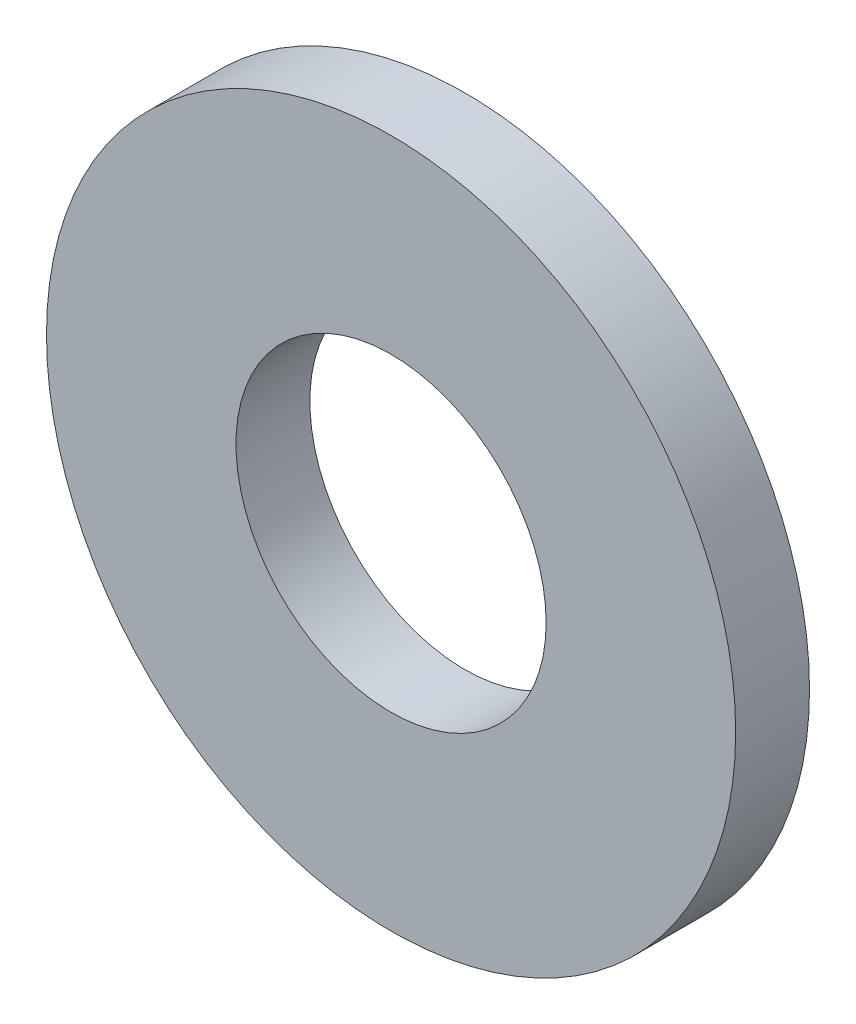
ISO-10303-21;
HEADER;
FILE_DESCRIPTION(('STEP AP214'),'2;1');
FILE_NAME('part.step','',(''),(''),'','','');
FILE_SCHEMA(('AUTOMOTIVE_DESIGN { 1 0 10303 214 1 1 1 1 }'));
ENDSEC;
DATA;
#1=APPLICATION_CONTEXT('core data for automotive mechanical design processes');
#2=APPLICATION_PROTOCOL_DEFINITION('international standard','automotive_design',2000,#1);
#3=PRODUCT_CONTEXT('',#1,'mechanical');
#4=PRODUCT('Part','Part','',(#3));
#5=PRODUCT_RELATED_PRODUCT_CATEGORY('part','',(#4));
#6=PRODUCT_DEFINITION_FORMATION('','',#4);
#7=PRODUCT_DEFINITION_CONTEXT('part definition',#1,'design');
#8=PRODUCT_DEFINITION('design','',#6,#7);
#9=PRODUCT_DEFINITION_SHAPE('','',#8);
#10=(LENGTH_UNIT() NAMED_UNIT(*) SI_UNIT(.MILLI.,.METRE.));
#11=(NAMED_UNIT(*) PLANE_ANGLE_UNIT() SI_UNIT($,.RADIAN.));
#12=(NAMED_UNIT(*) SI_UNIT($,.STERADIAN.) SOLID_ANGLE_UNIT());
#13=UNCERTAINTY_MEASURE_WITH_UNIT(LENGTH_MEASURE(1.E-05),#10,'distance_accuracy_value','');
#14=(GEOMETRIC_REPRESENTATION_CONTEXT(3) GLOBAL_UNCERTAINTY_ASSIGNED_CONTEXT((#13)) GLOBAL_UNIT_ASSIGNED_CONTEXT((#10,
#11,#12)) REPRESENTATION_CONTEXT('',''));
#15=CARTESIAN_POINT('',(0.,0.,0.));
#16=DIRECTION('',(0.,0.,1.));
#17=DIRECTION('',(1.,0.,0.));
#18=AXIS2_PLACEMENT_3D('',#15,#16,#17);
#19=CARTESIAN_POINT('',(0.,0.,1.5));
#20=DIRECTION('',(0.,0.,1.));
#21=DIRECTION('',(1.,0.,0.));
#22=AXIS2_PLACEMENT_3D('',#19,#20,#21);
#23=PLANE('',#22);
#24=CARTESIAN_POINT('',(0.,0.,1.5));
#25=DIRECTION('',(0.,0.,1.));
#26=DIRECTION('',(1.,0.,0.));
#27=AXIS2_PLACEMENT_3D('',#24,#25,#26);
#28=CIRCLE('',#27,7.);
#29=CARTESIAN_POINT('',(7.,0.,1.5));
#30=VERTEX_POINT('',#29);
#31=EDGE_CURVE('E10',#30,#30,#28,.T.);
#32=ORIENTED_EDGE('',*,*,#31,.T.);
#33=EDGE_LOOP('',(#32));
#34=FACE_BOUND('',#33,.T.);
#35=CARTESIAN_POINT('',(0.,0.,1.5));
#36=DIRECTION('',(0.,0.,1.));
#37=DIRECTION('',(1.,0.,0.));
#38=AXIS2_PLACEMENT_3D('',#35,#36,#37);
#39=CIRCLE('',#38,3.15);
#40=CARTESIAN_POINT('',(3.15,0.,1.5));
#41=VERTEX_POINT('',#40);
#42=EDGE_CURVE('E44',#41,#41,#39,.T.);
#43=ORIENTED_EDGE('',*,*,#42,.F.);
#44=EDGE_LOOP('',(#43));
#45=FACE_BOUND('',#44,.T.);
#46=ADVANCED_FACE('F33',(#34,#45),#23,.T.);
#47=CARTESIAN_POINT('',(0.,0.,0.));
#48=DIRECTION('',(0.,0.,1.));
#49=DIRECTION('',(1.,0.,0.));
#50=AXIS2_PLACEMENT_3D('',#47,#48,#49);
#51=PLANE('',#50);
#52=CARTESIAN_POINT('',(0.,0.,0.));
#53=DIRECTION('',(0.,0.,1.));
#54=DIRECTION('',(1.,0.,0.));
#55=AXIS2_PLACEMENT_3D('',#52,#53,#54);
#56=CIRCLE('',#55,7.);
#57=CARTESIAN_POINT('',(7.,0.,0.));
#58=VERTEX_POINT('',#57);
#59=EDGE_CURVE('E37',#58,#58,#56,.T.);
#60=ORIENTED_EDGE('',*,*,#59,.F.);
#61=EDGE_LOOP('',(#60));
#62=FACE_BOUND('',#61,.T.);
#63=CARTESIAN_POINT('',(0.,0.,0.));
#64=DIRECTION('',(0.,0.,1.));
#65=DIRECTION('',(1.,0.,0.));
#66=AXIS2_PLACEMENT_3D('',#63,#64,#65);
#67=CIRCLE('',#66,3.15);
#68=CARTESIAN_POINT('',(3.15,0.,0.));
#69=VERTEX_POINT('',#68);
#70=EDGE_CURVE('E46',#69,#69,#67,.T.);
#71=ORIENTED_EDGE('',*,*,#70,.T.);
#72=EDGE_LOOP('',(#71));
#73=FACE_BOUND('',#72,.T.);
#74=ADVANCED_FACE('F56',(#62,#73),#51,.F.);
#75=CARTESIAN_POINT('',(0.,0.,1.5));
#76=DIRECTION('',(0.,0.,-1.));
#77=DIRECTION('',(-1.,0.,0.));
#78=AXIS2_PLACEMENT_3D('',#75,#76,#77);
#79=CYLINDRICAL_SURFACE('',#78,7.);
#80=ORIENTED_EDGE('',*,*,#31,.F.);
#81=EDGE_LOOP('',(#80));
#82=FACE_BOUND('',#81,.T.);
#83=ORIENTED_EDGE('',*,*,#59,.T.);
#84=EDGE_LOOP('',(#83));
#85=FACE_BOUND('',#84,.T.);
#86=ADVANCED_FACE('F35',(#82,#85),#79,.T.);
#87=CARTESIAN_POINT('',(0.,0.,1.5));
#88=DIRECTION('',(0.,0.,-1.));
#89=DIRECTION('',(-1.,0.,0.));
#90=AXIS2_PLACEMENT_3D('',#87,#88,#89);
#91=CYLINDRICAL_SURFACE('',#90,3.15);
#92=ORIENTED_EDGE('',*,*,#42,.T.);
#93=EDGE_LOOP('',(#92));
#94=FACE_BOUND('',#93,.T.);
#95=ORIENTED_EDGE('',*,*,#70,.F.);
#96=EDGE_LOOP('',(#95));
#97=FACE_BOUND('',#96,.T.);
#98=ADVANCED_FACE('F52',(#94,#97),#91,.F.);
#99=CLOSED_SHELL('',(#46,#74,#86,#98));
#100=MANIFOLD_SOLID_BREP('B2',#99);
#101=ADVANCED_BREP_SHAPE_REPRESENTATION('',(#18,#100),#14);
#102=SHAPE_DEFINITION_REPRESENTATION(#9,#101);
ENDSEC;
END-ISO-10303-21;
